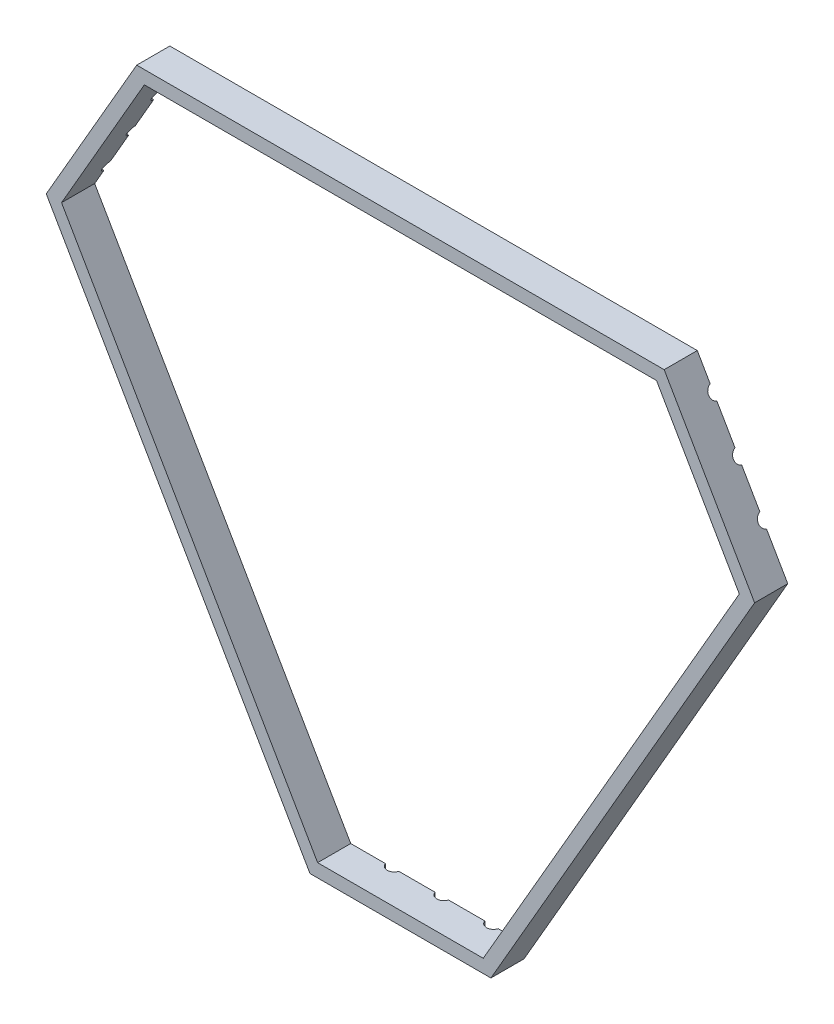
ISO-10303-21;
HEADER;
FILE_DESCRIPTION(('STEP AP214'),'2;1');
FILE_NAME('part.step','',(''),(''),'','','');
FILE_SCHEMA(('AUTOMOTIVE_DESIGN { 1 0 10303 214 1 1 1 1 }'));
ENDSEC;
DATA;
#1=APPLICATION_CONTEXT('core data for automotive mechanical design processes');
#2=APPLICATION_PROTOCOL_DEFINITION('international standard','automotive_design',2000,#1);
#3=PRODUCT_CONTEXT('',#1,'mechanical');
#4=PRODUCT('Part','Part','',(#3));
#5=PRODUCT_RELATED_PRODUCT_CATEGORY('part','',(#4));
#6=PRODUCT_DEFINITION_FORMATION('','',#4);
#7=PRODUCT_DEFINITION_CONTEXT('part definition',#1,'design');
#8=PRODUCT_DEFINITION('design','',#6,#7);
#9=PRODUCT_DEFINITION_SHAPE('','',#8);
#10=(LENGTH_UNIT() NAMED_UNIT(*) SI_UNIT(.MILLI.,.METRE.));
#11=(NAMED_UNIT(*) PLANE_ANGLE_UNIT() SI_UNIT($,.RADIAN.));
#12=(NAMED_UNIT(*) SI_UNIT($,.STERADIAN.) SOLID_ANGLE_UNIT());
#13=UNCERTAINTY_MEASURE_WITH_UNIT(LENGTH_MEASURE(1.E-05),#10,'distance_accuracy_value','');
#14=(GEOMETRIC_REPRESENTATION_CONTEXT(3) GLOBAL_UNCERTAINTY_ASSIGNED_CONTEXT((#13)) GLOBAL_UNIT_ASSIGNED_CONTEXT((#10,
#11,#12)) REPRESENTATION_CONTEXT('',''));
#15=CARTESIAN_POINT('',(0.,0.,0.));
#16=DIRECTION('',(0.,0.,1.));
#17=DIRECTION('',(1.,0.,0.));
#18=AXIS2_PLACEMENT_3D('',#15,#16,#17);
#19=CARTESIAN_POINT('',(0.,0.,-160.));
#20=DIRECTION('',(0.,0.,-1.));
#21=DIRECTION('',(-1.,0.,0.));
#22=AXIS2_PLACEMENT_3D('',#19,#20,#21);
#23=PLANE('',#22);
#24=DIRECTION('',(-0.499999995522719,0.866025406369398,0.));
#25=VECTOR('',#24,1.);
#26=CARTESIAN_POINT('',(-3.99997235182845,-287.07186238818,-160.));
#27=LINE('',#26,#25);
#28=CARTESIAN_POINT('',(-49.9999985666202,-207.397470720706,-160.));
#29=VERTEX_POINT('',#28);
#30=CARTESIAN_POINT('',(-204.611479041461,60.3974639297883,-160.));
#31=VERTEX_POINT('',#30);
#32=EDGE_CURVE('E339',#29,#31,#27,.T.);
#33=ORIENTED_EDGE('',*,*,#32,.T.);
#34=DIRECTION('',(0.500000000000001,0.866025403784438,0.));
#35=VECTOR('',#34,1.);
#36=CARTESIAN_POINT('',(-181.611475801544,100.234638115573,-160.));
#37=LINE('',#36,#35);
#38=CARTESIAN_POINT('',(-154.611479041461,147.000004308232,-160.));
#39=VERTEX_POINT('',#38);
#40=EDGE_CURVE('E323',#31,#39,#37,.T.);
#41=ORIENTED_EDGE('',*,*,#40,.T.);
#42=DIRECTION('',(1.,1.37761646906916E-10,0.));
#43=VECTOR('',#42,1.);
#44=CARTESIAN_POINT('',(-246.611440606458,147.000004295558,-160.));
#45=LINE('',#44,#43);
#46=CARTESIAN_POINT('',(154.611477608082,147.000006790919,-160.));
#47=VERTEX_POINT('',#46);
#48=EDGE_CURVE('E303',#39,#47,#45,.T.);
#49=ORIENTED_EDGE('',*,*,#48,.T.);
#50=DIRECTION('',(0.499999999999999,-0.866025403784439,0.));
#51=VECTOR('',#50,1.);
#52=CARTESIAN_POINT('',(177.611480847998,107.162832605133,-160.));
#53=LINE('',#52,#51);
#54=CARTESIAN_POINT('',(204.611504666339,60.3974195461969,-160.));
#55=VERTEX_POINT('',#54);
#56=EDGE_CURVE('E299',#47,#55,#53,.T.);
#57=ORIENTED_EDGE('',*,*,#56,.T.);
#58=DIRECTION('',(-0.499999988947861,-0.866025410165394,0.));
#59=VECTOR('',#58,1.);
#60=CARTESIAN_POINT('',(250.611606942048,140.071936189287,-160.));
#61=LINE('',#60,#59);
#62=CARTESIAN_POINT('',(50.0000572399014,-207.397470720707,-160.));
#63=VERTEX_POINT('',#62);
#64=EDGE_CURVE('E284',#55,#63,#61,.T.);
#65=ORIENTED_EDGE('',*,*,#64,.T.);
#66=DIRECTION('',(-1.,0.,0.));
#67=VECTOR('',#66,1.);
#68=CARTESIAN_POINT('',(3.99999495354567,-207.397470720707,-160.));
#69=LINE('',#68,#67);
#70=EDGE_CURVE('E473',#63,#29,#69,.T.);
#71=ORIENTED_EDGE('',*,*,#70,.T.);
#72=EDGE_LOOP('',(#33,#41,#49,#57,#65,#71));
#73=FACE_BOUND('',#72,.T.);
#74=DIRECTION('',(0.5,-0.866025403784439,0.));
#75=VECTOR('',#74,1.);
#76=CARTESIAN_POINT('',(-121.761531385957,-99.1028412015677,-160.));
#77=LINE('',#76,#75);
#78=CARTESIAN_POINT('',(-213.849079444843,60.3974706911128,-160.));
#79=VERTEX_POINT('',#78);
#80=CARTESIAN_POINT('',(-54.6187957541475,-215.397470720707,-160.));
#81=VERTEX_POINT('',#80);
#82=EDGE_CURVE('E328',#79,#81,#77,.T.);
#83=ORIENTED_EDGE('',*,*,#82,.T.);
#84=DIRECTION('',(-1.,0.,0.));
#85=VECTOR('',#84,1.);
#86=CARTESIAN_POINT('',(70.0008495564807,-215.397470720707,-160.));
#87=LINE('',#86,#85);
#88=CARTESIAN_POINT('',(54.6187957366916,-215.397470720707,-160.));
#89=VERTEX_POINT('',#88);
#90=EDGE_CURVE('E343',#89,#81,#87,.T.);
#91=ORIENTED_EDGE('',*,*,#90,.F.);
#92=DIRECTION('',(0.499999999940077,0.866025403819035,0.));
#93=VECTOR('',#92,1.);
#94=CARTESIAN_POINT('',(0.,-310.,-160.));
#95=LINE('',#94,#93);
#96=CARTESIAN_POINT('',(213.84907941067,60.3974707503004,-160.));
#97=VERTEX_POINT('',#96);
#98=EDGE_CURVE('E46',#89,#97,#95,.T.);
#99=ORIENTED_EDGE('',*,*,#98,.T.);
#100=DIRECTION('',(0.499999999999999,-0.866025403784439,0.));
#101=VECTOR('',#100,1.);
#102=CARTESIAN_POINT('',(151.539256776807,168.321249362758,-160.));
#103=LINE('',#102,#101);
#104=CARTESIAN_POINT('',(159.230283669615,155.000000022035,-160.));
#105=VERTEX_POINT('',#104);
#106=EDGE_CURVE('E352',#105,#97,#103,.T.);
#107=ORIENTED_EDGE('',*,*,#106,.F.);
#108=DIRECTION('',(-1.,-1.38387047711903E-10,0.));
#109=VECTOR('',#108,1.);
#110=CARTESIAN_POINT('',(268.467875151726,155.000000037152,-160.));
#111=LINE('',#110,#109);
#112=CARTESIAN_POINT('',(-159.230283695059,154.999999977965,-160.));
#113=VERTEX_POINT('',#112);
#114=EDGE_CURVE('E470',#105,#113,#111,.T.);
#115=ORIENTED_EDGE('',*,*,#114,.T.);
#116=DIRECTION('',(0.500000000000001,0.866025403784438,0.));
#117=VECTOR('',#116,1.);
#118=CARTESIAN_POINT('',(-221.540106333287,47.0762213579484,-160.));
#119=LINE('',#118,#117);
#120=EDGE_CURVE('E338',#79,#113,#119,.T.);
#121=ORIENTED_EDGE('',*,*,#120,.F.);
#122=EDGE_LOOP('',(#83,#91,#99,#107,#115,#121));
#123=FACE_BOUND('',#122,.T.);
#124=ADVANCED_FACE('F42',(#73,#123),#23,.F.);
#125=CARTESIAN_POINT('',(0.,0.,-180.));
#126=DIRECTION('',(0.,0.,-1.));
#127=DIRECTION('',(-1.,0.,0.));
#128=AXIS2_PLACEMENT_3D('',#125,#126,#127);
#129=PLANE('',#128);
#130=DIRECTION('',(0.500000000000001,0.866025403784438,0.));
#131=VECTOR('',#130,1.);
#132=CARTESIAN_POINT('',(-181.611475801544,100.234638115573,-180.));
#133=LINE('',#132,#131);
#134=CARTESIAN_POINT('',(-195.080469440302,76.9056568064219,-180.));
#135=VERTEX_POINT('',#134);
#136=CARTESIAN_POINT('',(-184.14248864262,95.8507952802198,-180.));
#137=VERTEX_POINT('',#136);
#138=EDGE_CURVE('E346',#135,#137,#133,.T.);
#139=ORIENTED_EDGE('',*,*,#138,.F.);
#140=DIRECTION('',(-0.866025403784439,0.5,0.));
#141=VECTOR('',#140,1.);
#142=CARTESIAN_POINT('',(-195.080469440302,76.9056568064219,-180.));
#143=LINE('',#142,#141);
#144=CARTESIAN_POINT('',(-202.008672670578,80.9056568064221,-180.));
#145=VERTEX_POINT('',#144);
#146=EDGE_CURVE('E311',#135,#145,#143,.T.);
#147=ORIENTED_EDGE('',*,*,#146,.T.);
#148=DIRECTION('',(0.500000000000001,0.866025403784438,0.));
#149=VECTOR('',#148,1.);
#150=CARTESIAN_POINT('',(-221.540106333287,47.0762213579484,-180.));
#151=LINE('',#150,#149);
#152=CARTESIAN_POINT('',(-191.070691872896,99.85079528022,-180.));
#153=VERTEX_POINT('',#152);
#154=EDGE_CURVE('E508',#145,#153,#151,.T.);
#155=ORIENTED_EDGE('',*,*,#154,.T.);
#156=DIRECTION('',(-0.866025403784438,0.5,0.));
#157=VECTOR('',#156,1.);
#158=CARTESIAN_POINT('',(-184.14248864262,95.8507952802198,-180.));
#159=LINE('',#158,#157);
#160=EDGE_CURVE('E308',#153,#137,#159,.F.);
#161=ORIENTED_EDGE('',*,*,#160,.T.);
#162=EDGE_LOOP('',(#139,#147,#155,#161));
#163=FACE_BOUND('',#162,.T.);
#164=ADVANCED_FACE('F506',(#163),#129,.T.);
#165=CARTESIAN_POINT('',(-187.008672670578,106.886418919955,-180.));
#166=VERTEX_POINT('',#165);
#167=CARTESIAN_POINT('',(-176.070691872896,125.831557393754,-180.));
#168=VERTEX_POINT('',#167);
#169=EDGE_CURVE('E333',#166,#168,#151,.T.);
#170=ORIENTED_EDGE('',*,*,#169,.T.);
#171=DIRECTION('',(-0.866025403784439,0.5,0.));
#172=VECTOR('',#171,1.);
#173=CARTESIAN_POINT('',(-169.14248864262,121.831557393753,-180.));
#174=LINE('',#173,#172);
#175=CARTESIAN_POINT('',(-169.14248864262,121.831557393753,-180.));
#176=VERTEX_POINT('',#175);
#177=EDGE_CURVE('E320',#168,#176,#174,.F.);
#178=ORIENTED_EDGE('',*,*,#177,.T.);
#179=CARTESIAN_POINT('',(-180.080469440302,102.886418919955,-180.));
#180=VERTEX_POINT('',#179);
#181=EDGE_CURVE('E494',#180,#176,#133,.T.);
#182=ORIENTED_EDGE('',*,*,#181,.F.);
#183=DIRECTION('',(-0.866025403784438,0.5,0.));
#184=VECTOR('',#183,1.);
#185=CARTESIAN_POINT('',(-180.080469440302,102.886418919955,-180.));
#186=LINE('',#185,#184);
#187=EDGE_CURVE('E305',#180,#166,#186,.T.);
#188=ORIENTED_EDGE('',*,*,#187,.T.);
#189=EDGE_LOOP('',(#170,#178,#182,#188));
#190=FACE_BOUND('',#189,.T.);
#191=ADVANCED_FACE('F513',(#190),#129,.T.);
#192=DIRECTION('',(-0.866025403784439,0.5,0.));
#193=VECTOR('',#192,1.);
#194=CARTESIAN_POINT('',(-165.080469440302,128.867181033489,-180.));
#195=LINE('',#194,#193);
#196=CARTESIAN_POINT('',(-165.080469440302,128.867181033489,-180.));
#197=VERTEX_POINT('',#196);
#198=CARTESIAN_POINT('',(-172.008672670578,132.867181033489,-180.));
#199=VERTEX_POINT('',#198);
#200=EDGE_CURVE('E317',#197,#199,#195,.T.);
#201=ORIENTED_EDGE('',*,*,#200,.T.);
#202=CARTESIAN_POINT('',(-159.230283695059,154.999999977965,-180.));
#203=VERTEX_POINT('',#202);
#204=EDGE_CURVE('E330',#199,#203,#151,.T.);
#205=ORIENTED_EDGE('',*,*,#204,.T.);
#206=DIRECTION('',(-1.,-1.38387047711903E-10,0.));
#207=VECTOR('',#206,1.);
#208=CARTESIAN_POINT('',(268.467875151726,155.000000037152,-180.));
#209=LINE('',#208,#207);
#210=CARTESIAN_POINT('',(159.230283669615,155.000000022035,-180.));
#211=VERTEX_POINT('',#210);
#212=EDGE_CURVE('E351',#211,#203,#209,.T.);
#213=ORIENTED_EDGE('',*,*,#212,.F.);
#214=DIRECTION('',(0.499999999999999,-0.866025403784439,0.));
#215=VECTOR('',#214,1.);
#216=CARTESIAN_POINT('',(151.539256776807,168.321249362758,-180.));
#217=LINE('',#216,#215);
#218=CARTESIAN_POINT('',(167.008671237198,141.52743755402,-180.));
#219=VERTEX_POINT('',#218);
#220=EDGE_CURVE('E304',#211,#219,#217,.T.);
#221=ORIENTED_EDGE('',*,*,#220,.T.);
#222=DIRECTION('',(0.866025403784439,0.5,0.));
#223=VECTOR('',#222,1.);
#224=CARTESIAN_POINT('',(160.080468006922,137.52743755402,-180.));
#225=LINE('',#224,#223);
#226=CARTESIAN_POINT('',(160.080468006922,137.52743755402,-180.));
#227=VERTEX_POINT('',#226);
#228=EDGE_CURVE('E290',#219,#227,#225,.F.);
#229=ORIENTED_EDGE('',*,*,#228,.T.);
#230=DIRECTION('',(0.499999999999999,-0.866025403784439,0.));
#231=VECTOR('',#230,1.);
#232=CARTESIAN_POINT('',(177.611480847998,107.162832605133,-180.));
#233=LINE('',#232,#231);
#234=CARTESIAN_POINT('',(154.611477608082,147.000006790919,-180.));
#235=VERTEX_POINT('',#234);
#236=EDGE_CURVE('E355',#235,#227,#233,.T.);
#237=ORIENTED_EDGE('',*,*,#236,.F.);
#238=DIRECTION('',(1.,1.37761646906916E-10,0.));
#239=VECTOR('',#238,1.);
#240=CARTESIAN_POINT('',(-246.611440606458,147.000004295558,-180.));
#241=LINE('',#240,#239);
#242=CARTESIAN_POINT('',(-154.611479041461,147.000004308232,-180.));
#243=VERTEX_POINT('',#242);
#244=EDGE_CURVE('E348',#243,#235,#241,.T.);
#245=ORIENTED_EDGE('',*,*,#244,.F.);
#246=EDGE_CURVE('E347',#197,#243,#133,.T.);
#247=ORIENTED_EDGE('',*,*,#246,.F.);
#248=EDGE_LOOP('',(#201,#205,#213,#221,#229,#237,#245,#247));
#249=FACE_BOUND('',#248,.T.);
#250=ADVANCED_FACE('F519',(#249),#129,.T.);
#251=CARTESIAN_POINT('',(164.14248720924,130.491813914284,-180.));
#252=VERTEX_POINT('',#251);
#253=CARTESIAN_POINT('',(175.080468006922,111.546675440487,-180.));
#254=VERTEX_POINT('',#253);
#255=EDGE_CURVE('E358',#252,#254,#233,.T.);
#256=ORIENTED_EDGE('',*,*,#255,.F.);
#257=DIRECTION('',(0.866025403784439,0.5,0.));
#258=VECTOR('',#257,1.);
#259=CARTESIAN_POINT('',(164.14248720924,130.491813914284,-180.));
#260=LINE('',#259,#258);
#261=CARTESIAN_POINT('',(171.070690439516,134.491813914285,-180.));
#262=VERTEX_POINT('',#261);
#263=EDGE_CURVE('E287',#252,#262,#260,.T.);
#264=ORIENTED_EDGE('',*,*,#263,.T.);
#265=CARTESIAN_POINT('',(182.008671237198,115.546675440487,-180.));
#266=VERTEX_POINT('',#265);
#267=EDGE_CURVE('E630',#262,#266,#217,.T.);
#268=ORIENTED_EDGE('',*,*,#267,.T.);
#269=DIRECTION('',(0.866025403784439,0.5,0.));
#270=VECTOR('',#269,1.);
#271=CARTESIAN_POINT('',(175.080468006922,111.546675440487,-180.));
#272=LINE('',#271,#270);
#273=EDGE_CURVE('E283',#266,#254,#272,.F.);
#274=ORIENTED_EDGE('',*,*,#273,.T.);
#275=EDGE_LOOP('',(#256,#264,#268,#274));
#276=FACE_BOUND('',#275,.T.);
#277=ADVANCED_FACE('F590',(#276),#129,.T.);
#278=CARTESIAN_POINT('',(186.070690439516,108.511051800752,-180.));
#279=VERTEX_POINT('',#278);
#280=CARTESIAN_POINT('',(197.008671237198,89.5659133269539,-180.));
#281=VERTEX_POINT('',#280);
#282=EDGE_CURVE('E302',#279,#281,#217,.T.);
#283=ORIENTED_EDGE('',*,*,#282,.T.);
#284=DIRECTION('',(0.866025403784439,0.5,0.));
#285=VECTOR('',#284,1.);
#286=CARTESIAN_POINT('',(190.080468006922,85.5659133269537,-180.));
#287=LINE('',#286,#285);
#288=CARTESIAN_POINT('',(190.080468006922,85.5659133269537,-180.));
#289=VERTEX_POINT('',#288);
#290=EDGE_CURVE('E296',#281,#289,#287,.F.);
#291=ORIENTED_EDGE('',*,*,#290,.T.);
#292=CARTESIAN_POINT('',(179.14248720924,104.511051800751,-180.));
#293=VERTEX_POINT('',#292);
#294=EDGE_CURVE('E636',#293,#289,#233,.T.);
#295=ORIENTED_EDGE('',*,*,#294,.F.);
#296=DIRECTION('',(0.866025403784439,0.5,0.));
#297=VECTOR('',#296,1.);
#298=CARTESIAN_POINT('',(179.14248720924,104.511051800751,-180.));
#299=LINE('',#298,#297);
#300=EDGE_CURVE('E280',#293,#279,#299,.T.);
#301=ORIENTED_EDGE('',*,*,#300,.T.);
#302=EDGE_LOOP('',(#283,#291,#295,#301));
#303=FACE_BOUND('',#302,.T.);
#304=ADVANCED_FACE('F583',(#303),#129,.T.);
#305=CARTESIAN_POINT('',(-213.849079444843,60.3974706911128,-180.));
#306=VERTEX_POINT('',#305);
#307=CARTESIAN_POINT('',(-206.070691872896,73.8700331666869,-180.));
#308=VERTEX_POINT('',#307);
#309=EDGE_CURVE('E334',#306,#308,#151,.T.);
#310=ORIENTED_EDGE('',*,*,#309,.T.);
#311=DIRECTION('',(-0.866025403784439,0.5,0.));
#312=VECTOR('',#311,1.);
#313=CARTESIAN_POINT('',(-199.14248864262,69.8700331666867,-180.));
#314=LINE('',#313,#312);
#315=CARTESIAN_POINT('',(-199.14248864262,69.8700331666867,-180.));
#316=VERTEX_POINT('',#315);
#317=EDGE_CURVE('E314',#308,#316,#314,.F.);
#318=ORIENTED_EDGE('',*,*,#317,.T.);
#319=CARTESIAN_POINT('',(-204.611479041461,60.3974639297883,-180.));
#320=VERTEX_POINT('',#319);
#321=EDGE_CURVE('E342',#320,#316,#133,.T.);
#322=ORIENTED_EDGE('',*,*,#321,.F.);
#323=DIRECTION('',(-0.499999995522719,0.866025406369398,0.));
#324=VECTOR('',#323,1.);
#325=CARTESIAN_POINT('',(-3.99997235182845,-287.07186238818,-180.));
#326=LINE('',#325,#324);
#327=CARTESIAN_POINT('',(-49.9999985666202,-207.397470720706,-180.));
#328=VERTEX_POINT('',#327);
#329=EDGE_CURVE('E335',#328,#320,#326,.T.);
#330=ORIENTED_EDGE('',*,*,#329,.F.);
#331=DIRECTION('',(-1.,0.,0.));
#332=VECTOR('',#331,1.);
#333=CARTESIAN_POINT('',(3.99999495354567,-207.397470720707,-180.));
#334=LINE('',#333,#332);
#335=CARTESIAN_POINT('',(-29.0620177689376,-207.397470720707,-180.));
#336=VERTEX_POINT('',#335);
#337=EDGE_CURVE('E354',#336,#328,#334,.T.);
#338=ORIENTED_EDGE('',*,*,#337,.F.);
#339=DIRECTION('',(0.,-1.,0.));
#340=VECTOR('',#339,1.);
#341=CARTESIAN_POINT('',(-29.0620177689376,-207.397470720707,-180.));
#342=LINE('',#341,#340);
#343=CARTESIAN_POINT('',(-29.0620177689376,-215.397470720707,-180.));
#344=VERTEX_POINT('',#343);
#345=EDGE_CURVE('E274',#336,#344,#342,.T.);
#346=ORIENTED_EDGE('',*,*,#345,.T.);
#347=DIRECTION('',(-1.,0.,0.));
#348=VECTOR('',#347,1.);
#349=CARTESIAN_POINT('',(70.0008495564807,-215.397470720707,-180.));
#350=LINE('',#349,#348);
#351=CARTESIAN_POINT('',(-54.6187957541475,-215.397470720707,-180.));
#352=VERTEX_POINT('',#351);
#353=EDGE_CURVE('E324',#344,#352,#350,.T.);
#354=ORIENTED_EDGE('',*,*,#353,.T.);
#355=DIRECTION('',(0.5,-0.866025403784439,0.));
#356=VECTOR('',#355,1.);
#357=CARTESIAN_POINT('',(-121.761531385957,-99.1028412015677,-180.));
#358=LINE('',#357,#356);
#359=EDGE_CURVE('E340',#306,#352,#358,.T.);
#360=ORIENTED_EDGE('',*,*,#359,.F.);
#361=EDGE_LOOP('',(#310,#318,#322,#330,#338,#346,#354,#360));
#362=FACE_BOUND('',#361,.T.);
#363=ADVANCED_FACE('F548',(#362),#129,.T.);
#364=CARTESIAN_POINT('',(194.14248720924,78.5302896872185,-180.));
#365=VERTEX_POINT('',#364);
#366=CARTESIAN_POINT('',(204.611504666339,60.3974195461969,-180.));
#367=VERTEX_POINT('',#366);
#368=EDGE_CURVE('E359',#365,#367,#233,.T.);
#369=ORIENTED_EDGE('',*,*,#368,.F.);
#370=DIRECTION('',(0.866025403784439,0.5,0.));
#371=VECTOR('',#370,1.);
#372=CARTESIAN_POINT('',(194.14248720924,78.5302896872185,-180.));
#373=LINE('',#372,#371);
#374=CARTESIAN_POINT('',(201.070690439516,82.5302896872188,-180.));
#375=VERTEX_POINT('',#374);
#376=EDGE_CURVE('E293',#365,#375,#373,.T.);
#377=ORIENTED_EDGE('',*,*,#376,.T.);
#378=CARTESIAN_POINT('',(213.84907941067,60.3974707503004,-180.));
#379=VERTEX_POINT('',#378);
#380=EDGE_CURVE('E300',#375,#379,#217,.T.);
#381=ORIENTED_EDGE('',*,*,#380,.T.);
#382=DIRECTION('',(0.499999999940077,0.866025403819035,0.));
#383=VECTOR('',#382,1.);
#384=CARTESIAN_POINT('',(0.,-310.,-180.));
#385=LINE('',#384,#383);
#386=CARTESIAN_POINT('',(54.6187957366916,-215.397470720707,-180.));
#387=VERTEX_POINT('',#386);
#388=EDGE_CURVE('E60',#387,#379,#385,.T.);
#389=ORIENTED_EDGE('',*,*,#388,.F.);
#390=CARTESIAN_POINT('',(39.0620206356984,-215.397470720707,-180.));
#391=VERTEX_POINT('',#390);
#392=EDGE_CURVE('E329',#387,#391,#350,.T.);
#393=ORIENTED_EDGE('',*,*,#392,.T.);
#394=DIRECTION('',(0.,-1.,0.));
#395=VECTOR('',#394,1.);
#396=CARTESIAN_POINT('',(39.0620206356984,-207.397470720707,-180.));
#397=LINE('',#396,#395);
#398=CARTESIAN_POINT('',(39.0620206356984,-207.397470720707,-180.));
#399=VERTEX_POINT('',#398);
#400=EDGE_CURVE('E267',#391,#399,#397,.F.);
#401=ORIENTED_EDGE('',*,*,#400,.T.);
#402=CARTESIAN_POINT('',(50.0000572399014,-207.397470720707,-180.));
#403=VERTEX_POINT('',#402);
#404=EDGE_CURVE('E259',#403,#399,#334,.T.);
#405=ORIENTED_EDGE('',*,*,#404,.F.);
#406=DIRECTION('',(-0.499999988947861,-0.866025410165394,0.));
#407=VECTOR('',#406,1.);
#408=CARTESIAN_POINT('',(250.611606942048,140.071936189287,-180.));
#409=LINE('',#408,#407);
#410=EDGE_CURVE('E360',#367,#403,#409,.T.);
#411=ORIENTED_EDGE('',*,*,#410,.F.);
#412=EDGE_LOOP('',(#369,#377,#381,#389,#393,#401,#405,#411));
#413=FACE_BOUND('',#412,.T.);
#414=ADVANCED_FACE('F569',(#413),#129,.T.);
#415=CARTESIAN_POINT('',(30.9379822310624,-207.397470720707,-180.));
#416=VERTEX_POINT('',#415);
#417=CARTESIAN_POINT('',(9.06202063569835,-207.397470720707,-180.));
#418=VERTEX_POINT('',#417);
#419=EDGE_CURVE('E251',#416,#418,#334,.T.);
#420=ORIENTED_EDGE('',*,*,#419,.F.);
#421=DIRECTION('',(0.,-1.,0.));
#422=VECTOR('',#421,1.);
#423=CARTESIAN_POINT('',(30.9379822310624,-207.397470720707,-180.));
#424=LINE('',#423,#422);
#425=CARTESIAN_POINT('',(30.9379822310624,-215.397470720707,-180.));
#426=VERTEX_POINT('',#425);
#427=EDGE_CURVE('E265',#416,#426,#424,.T.);
#428=ORIENTED_EDGE('',*,*,#427,.T.);
#429=CARTESIAN_POINT('',(9.06202063569835,-215.397470720707,-180.));
#430=VERTEX_POINT('',#429);
#431=EDGE_CURVE('E264',#426,#430,#350,.T.);
#432=ORIENTED_EDGE('',*,*,#431,.T.);
#433=DIRECTION('',(0.,-1.,0.));
#434=VECTOR('',#433,1.);
#435=CARTESIAN_POINT('',(9.06202063569835,-207.397470720707,-180.));
#436=LINE('',#435,#434);
#437=EDGE_CURVE('E244',#430,#418,#436,.F.);
#438=ORIENTED_EDGE('',*,*,#437,.T.);
#439=EDGE_LOOP('',(#420,#428,#432,#438));
#440=FACE_BOUND('',#439,.T.);
#441=ADVANCED_FACE('F262',(#440),#129,.T.);
#442=CARTESIAN_POINT('',(0.937982231062389,-215.397470720707,-180.));
#443=VERTEX_POINT('',#442);
#444=CARTESIAN_POINT('',(-20.9379793643016,-215.397470720707,-180.));
#445=VERTEX_POINT('',#444);
#446=EDGE_CURVE('E327',#443,#445,#350,.T.);
#447=ORIENTED_EDGE('',*,*,#446,.T.);
#448=DIRECTION('',(0.,-1.,0.));
#449=VECTOR('',#448,1.);
#450=CARTESIAN_POINT('',(-20.9379793643016,-207.397470720707,-180.));
#451=LINE('',#450,#449);
#452=CARTESIAN_POINT('',(-20.9379793643016,-207.397470720707,-180.));
#453=VERTEX_POINT('',#452);
#454=EDGE_CURVE('E277',#445,#453,#451,.F.);
#455=ORIENTED_EDGE('',*,*,#454,.T.);
#456=CARTESIAN_POINT('',(0.937982231062389,-207.397470720707,-180.));
#457=VERTEX_POINT('',#456);
#458=EDGE_CURVE('E258',#457,#453,#334,.T.);
#459=ORIENTED_EDGE('',*,*,#458,.F.);
#460=DIRECTION('',(0.,-1.,0.));
#461=VECTOR('',#460,1.);
#462=CARTESIAN_POINT('',(0.937982231062389,-207.397470720707,-180.));
#463=LINE('',#462,#461);
#464=EDGE_CURVE('E246',#457,#443,#463,.T.);
#465=ORIENTED_EDGE('',*,*,#464,.T.);
#466=EDGE_LOOP('',(#447,#455,#459,#465));
#467=FACE_BOUND('',#466,.T.);
#468=ADVANCED_FACE('F556',(#467),#129,.T.);
#469=CARTESIAN_POINT('',(-181.611475801544,100.234638115573,140.));
#470=DIRECTION('',(0.866025403784437,-0.5,0.));
#471=DIRECTION('',(0.,0.,-1.));
#472=AXIS2_PLACEMENT_3D('',#469,#470,#471);
#473=PLANE('',#472);
#474=ORIENTED_EDGE('',*,*,#40,.F.);
#475=DIRECTION('',(0.,0.,-1.));
#476=VECTOR('',#475,1.);
#477=CARTESIAN_POINT('',(-204.611479041461,60.3974639297883,140.));
#478=LINE('',#477,#476);
#479=EDGE_CURVE('E445',#31,#320,#478,.T.);
#480=ORIENTED_EDGE('',*,*,#479,.T.);
#481=ORIENTED_EDGE('',*,*,#321,.T.);
#482=CARTESIAN_POINT('',(-197.111479041461,73.3878449865543,-181.25));
#483=DIRECTION('',(-0.866025403784439,0.5,0.));
#484=DIRECTION('',(0.5,0.866025403784439,0.));
#485=AXIS2_PLACEMENT_3D('',#482,#483,#484);
#486=CIRCLE('',#485,4.25);
#487=EDGE_CURVE('E427',#316,#135,#486,.T.);
#488=ORIENTED_EDGE('',*,*,#487,.T.);
#489=ORIENTED_EDGE('',*,*,#138,.T.);
#490=CARTESIAN_POINT('',(-182.111479041461,99.3686071000874,-181.25));
#491=DIRECTION('',(-0.866025403784438,0.5,0.));
#492=DIRECTION('',(0.5,0.866025403784438,0.));
#493=AXIS2_PLACEMENT_3D('',#490,#491,#492);
#494=CIRCLE('',#493,4.25);
#495=EDGE_CURVE('E420',#137,#180,#494,.T.);
#496=ORIENTED_EDGE('',*,*,#495,.T.);
#497=ORIENTED_EDGE('',*,*,#181,.T.);
#498=CARTESIAN_POINT('',(-167.111479041461,125.349369213621,-181.25));
#499=DIRECTION('',(-0.866025403784439,0.5,0.));
#500=DIRECTION('',(0.5,0.866025403784439,0.));
#501=AXIS2_PLACEMENT_3D('',#498,#499,#500);
#502=CIRCLE('',#501,4.25);
#503=EDGE_CURVE('E433',#176,#197,#502,.T.);
#504=ORIENTED_EDGE('',*,*,#503,.T.);
#505=ORIENTED_EDGE('',*,*,#246,.T.);
#506=DIRECTION('',(0.,0.,-1.));
#507=VECTOR('',#506,1.);
#508=CARTESIAN_POINT('',(-154.611479041461,147.000004308232,140.));
#509=LINE('',#508,#507);
#510=EDGE_CURVE('E437',#39,#243,#509,.T.);
#511=ORIENTED_EDGE('',*,*,#510,.F.);
#512=EDGE_LOOP('',(#474,#480,#481,#488,#489,#496,#497,#504,#505,#511));
#513=FACE_BOUND('',#512,.T.);
#514=ADVANCED_FACE('F501',(#513),#473,.T.);
#515=CARTESIAN_POINT('',(-221.540106333287,47.0762213579484,0.));
#516=DIRECTION('',(0.866025403784437,-0.5,0.));
#517=DIRECTION('',(0.,0.,-1.));
#518=AXIS2_PLACEMENT_3D('',#515,#516,#517);
#519=PLANE('',#518);
#520=DIRECTION('',(0.,0.,-1.));
#521=VECTOR('',#520,1.);
#522=CARTESIAN_POINT('',(-213.849079444843,60.3974706911128,0.));
#523=LINE('',#522,#521);
#524=EDGE_CURVE('E363',#79,#306,#523,.T.);
#525=ORIENTED_EDGE('',*,*,#524,.F.);
#526=ORIENTED_EDGE('',*,*,#120,.T.);
#527=DIRECTION('',(0.,0.,1.));
#528=VECTOR('',#527,1.);
#529=CARTESIAN_POINT('',(-159.230283695059,154.999999977965,0.));
#530=LINE('',#529,#528);
#531=EDGE_CURVE('E423',#203,#113,#530,.T.);
#532=ORIENTED_EDGE('',*,*,#531,.F.);
#533=ORIENTED_EDGE('',*,*,#204,.F.);
#534=CARTESIAN_POINT('',(-174.039682271737,129.349369213621,-181.25));
#535=DIRECTION('',(0.866025403784439,-0.5,0.));
#536=DIRECTION('',(0.5,0.866025403784439,0.));
#537=AXIS2_PLACEMENT_3D('',#534,#535,#536);
#538=CIRCLE('',#537,4.25);
#539=EDGE_CURVE('E435',#199,#168,#538,.T.);
#540=ORIENTED_EDGE('',*,*,#539,.T.);
#541=ORIENTED_EDGE('',*,*,#169,.F.);
#542=CARTESIAN_POINT('',(-189.039682271737,103.368607100087,-181.25));
#543=DIRECTION('',(0.866025403784438,-0.5,0.));
#544=DIRECTION('',(0.5,0.866025403784438,0.));
#545=AXIS2_PLACEMENT_3D('',#542,#543,#544);
#546=CIRCLE('',#545,4.25);
#547=EDGE_CURVE('E424',#166,#153,#546,.T.);
#548=ORIENTED_EDGE('',*,*,#547,.T.);
#549=ORIENTED_EDGE('',*,*,#154,.F.);
#550=CARTESIAN_POINT('',(-204.039682271737,77.3878449865543,-181.25));
#551=DIRECTION('',(0.866025403784439,-0.5,0.));
#552=DIRECTION('',(0.5,0.866025403784439,0.));
#553=AXIS2_PLACEMENT_3D('',#550,#551,#552);
#554=CIRCLE('',#553,4.25);
#555=EDGE_CURVE('E430',#145,#308,#554,.T.);
#556=ORIENTED_EDGE('',*,*,#555,.T.);
#557=ORIENTED_EDGE('',*,*,#309,.F.);
#558=EDGE_LOOP('',(#525,#526,#532,#533,#540,#541,#548,#549,#556,#557));
#559=FACE_BOUND('',#558,.T.);
#560=ADVANCED_FACE('F537',(#559),#519,.F.);
#561=CARTESIAN_POINT('',(-3.99997235182845,-287.07186238818,0.));
#562=DIRECTION('',(0.866025406369398,0.499999995522719,0.));
#563=DIRECTION('',(0.,0.,-1.));
#564=AXIS2_PLACEMENT_3D('',#561,#562,#563);
#565=PLANE('',#564);
#566=ORIENTED_EDGE('',*,*,#32,.F.);
#567=DIRECTION('',(0.,0.,-1.));
#568=VECTOR('',#567,1.);
#569=CARTESIAN_POINT('',(-49.9999985666202,-207.397470720706,140.));
#570=LINE('',#569,#568);
#571=EDGE_CURVE('E364',#29,#328,#570,.T.);
#572=ORIENTED_EDGE('',*,*,#571,.T.);
#573=ORIENTED_EDGE('',*,*,#329,.T.);
#574=ORIENTED_EDGE('',*,*,#479,.F.);
#575=EDGE_LOOP('',(#566,#572,#573,#574));
#576=FACE_BOUND('',#575,.T.);
#577=ADVANCED_FACE('F563',(#576),#565,.T.);
#578=CARTESIAN_POINT('',(-246.611440606458,147.000004295558,-100.));
#579=DIRECTION('',(1.37761646906916E-10,-1.,0.));
#580=DIRECTION('',(0.,0.,-1.));
#581=AXIS2_PLACEMENT_3D('',#578,#579,#580);
#582=PLANE('',#581);
#583=ORIENTED_EDGE('',*,*,#48,.F.);
#584=ORIENTED_EDGE('',*,*,#510,.T.);
#585=ORIENTED_EDGE('',*,*,#244,.T.);
#586=DIRECTION('',(0.,0.,-1.));
#587=VECTOR('',#586,1.);
#588=CARTESIAN_POINT('',(154.611477608082,147.000006790919,140.));
#589=LINE('',#588,#587);
#590=EDGE_CURVE('E382',#47,#235,#589,.T.);
#591=ORIENTED_EDGE('',*,*,#590,.F.);
#592=EDGE_LOOP('',(#583,#584,#585,#591));
#593=FACE_BOUND('',#592,.T.);
#594=ADVANCED_FACE('F522',(#593),#582,.T.);
#595=CARTESIAN_POINT('',(151.539256776807,168.321249362758,0.));
#596=DIRECTION('',(-0.86602540378444,-0.5,0.));
#597=DIRECTION('',(-0.5,0.86602540378444,0.));
#598=AXIS2_PLACEMENT_3D('',#595,#596,#597);
#599=PLANE('',#598);
#600=DIRECTION('',(0.,0.,-1.));
#601=VECTOR('',#600,1.);
#602=CARTESIAN_POINT('',(159.230283669615,155.000000022035,0.));
#603=LINE('',#602,#601);
#604=EDGE_CURVE('E492',#105,#211,#603,.T.);
#605=ORIENTED_EDGE('',*,*,#604,.F.);
#606=ORIENTED_EDGE('',*,*,#106,.T.);
#607=DIRECTION('',(0.,0.,1.));
#608=VECTOR('',#607,1.);
#609=CARTESIAN_POINT('',(213.84907941067,60.3974707503004,0.));
#610=LINE('',#609,#608);
#611=EDGE_CURVE('E373',#379,#97,#610,.T.);
#612=ORIENTED_EDGE('',*,*,#611,.F.);
#613=ORIENTED_EDGE('',*,*,#380,.F.);
#614=CARTESIAN_POINT('',(199.039680838357,86.0481015070862,-181.25));
#615=DIRECTION('',(-0.866025403784439,-0.5,0.));
#616=DIRECTION('',(0.5,-0.866025403784439,0.));
#617=AXIS2_PLACEMENT_3D('',#614,#615,#616);
#618=CIRCLE('',#617,4.25);
#619=EDGE_CURVE('E389',#375,#281,#618,.T.);
#620=ORIENTED_EDGE('',*,*,#619,.T.);
#621=ORIENTED_EDGE('',*,*,#282,.F.);
#622=CARTESIAN_POINT('',(184.039680838357,112.028863620619,-181.25));
#623=DIRECTION('',(-0.866025403784439,-0.5,0.));
#624=DIRECTION('',(0.5,-0.866025403784439,0.));
#625=AXIS2_PLACEMENT_3D('',#622,#623,#624);
#626=CIRCLE('',#625,4.25);
#627=EDGE_CURVE('E406',#279,#266,#626,.T.);
#628=ORIENTED_EDGE('',*,*,#627,.T.);
#629=ORIENTED_EDGE('',*,*,#267,.F.);
#630=CARTESIAN_POINT('',(169.039680838357,138.009625734153,-181.25));
#631=DIRECTION('',(-0.866025403784439,-0.5,0.));
#632=DIRECTION('',(0.5,-0.866025403784439,0.));
#633=AXIS2_PLACEMENT_3D('',#630,#631,#632);
#634=CIRCLE('',#633,4.25);
#635=EDGE_CURVE('E412',#262,#219,#634,.T.);
#636=ORIENTED_EDGE('',*,*,#635,.T.);
#637=ORIENTED_EDGE('',*,*,#220,.F.);
#638=EDGE_LOOP('',(#605,#606,#612,#613,#620,#621,#628,#629,#636,#637));
#639=FACE_BOUND('',#638,.T.);
#640=ADVANCED_FACE('F489',(#639),#599,.F.);
#641=CARTESIAN_POINT('',(3.99999495354567,-207.397470720707,140.));
#642=DIRECTION('',(0.,1.,0.));
#643=DIRECTION('',(1.,0.,0.));
#644=AXIS2_PLACEMENT_3D('',#641,#642,#643);
#645=PLANE('',#644);
#646=ORIENTED_EDGE('',*,*,#70,.F.);
#647=DIRECTION('',(0.,0.,-1.));
#648=VECTOR('',#647,1.);
#649=CARTESIAN_POINT('',(50.0000572399014,-207.397470720707,0.));
#650=LINE('',#649,#648);
#651=EDGE_CURVE('E369',#63,#403,#650,.T.);
#652=ORIENTED_EDGE('',*,*,#651,.T.);
#653=ORIENTED_EDGE('',*,*,#404,.T.);
#654=CARTESIAN_POINT('',(35.0000014333804,-207.397470720707,-181.25));
#655=DIRECTION('',(0.,-1.,0.));
#656=DIRECTION('',(-1.,0.,0.));
#657=AXIS2_PLACEMENT_3D('',#654,#655,#656);
#658=CIRCLE('',#657,4.25);
#659=EDGE_CURVE('E254',#399,#416,#658,.T.);
#660=ORIENTED_EDGE('',*,*,#659,.T.);
#661=ORIENTED_EDGE('',*,*,#419,.T.);
#662=CARTESIAN_POINT('',(5.00000143338037,-207.397470720707,-181.25));
#663=DIRECTION('',(0.,-1.,0.));
#664=DIRECTION('',(-1.,0.,0.));
#665=AXIS2_PLACEMENT_3D('',#662,#663,#664);
#666=CIRCLE('',#665,4.25);
#667=EDGE_CURVE('E11',#418,#457,#666,.T.);
#668=ORIENTED_EDGE('',*,*,#667,.T.);
#669=ORIENTED_EDGE('',*,*,#458,.T.);
#670=CARTESIAN_POINT('',(-24.9999985666196,-207.397470720707,-181.25));
#671=DIRECTION('',(0.,-1.,0.));
#672=DIRECTION('',(-1.,0.,0.));
#673=AXIS2_PLACEMENT_3D('',#670,#671,#672);
#674=CIRCLE('',#673,4.25);
#675=EDGE_CURVE('E399',#453,#336,#674,.T.);
#676=ORIENTED_EDGE('',*,*,#675,.T.);
#677=ORIENTED_EDGE('',*,*,#337,.T.);
#678=ORIENTED_EDGE('',*,*,#571,.F.);
#679=EDGE_LOOP('',(#646,#652,#653,#660,#661,#668,#669,#676,#677,#678));
#680=FACE_BOUND('',#679,.T.);
#681=ADVANCED_FACE('F252',(#680),#645,.T.);
#682=CARTESIAN_POINT('',(70.0008495564807,-215.397470720707,0.));
#683=DIRECTION('',(0.,1.,0.));
#684=DIRECTION('',(1.,0.,0.));
#685=AXIS2_PLACEMENT_3D('',#682,#683,#684);
#686=PLANE('',#685);
#687=DIRECTION('',(0.,0.,-1.));
#688=VECTOR('',#687,1.);
#689=CARTESIAN_POINT('',(54.6187957366916,-215.397470720707,0.));
#690=LINE('',#689,#688);
#691=EDGE_CURVE('E376',#89,#387,#690,.T.);
#692=ORIENTED_EDGE('',*,*,#691,.F.);
#693=ORIENTED_EDGE('',*,*,#90,.T.);
#694=DIRECTION('',(0.,0.,1.));
#695=VECTOR('',#694,1.);
#696=CARTESIAN_POINT('',(-54.6187957541475,-215.397470720707,0.));
#697=LINE('',#696,#695);
#698=EDGE_CURVE('E452',#352,#81,#697,.T.);
#699=ORIENTED_EDGE('',*,*,#698,.F.);
#700=ORIENTED_EDGE('',*,*,#353,.F.);
#701=CARTESIAN_POINT('',(-24.9999985666196,-215.397470720707,-181.25));
#702=DIRECTION('',(0.,1.,0.));
#703=DIRECTION('',(-1.,0.,0.));
#704=AXIS2_PLACEMENT_3D('',#701,#702,#703);
#705=CIRCLE('',#704,4.25);
#706=EDGE_CURVE('E368',#344,#445,#705,.T.);
#707=ORIENTED_EDGE('',*,*,#706,.T.);
#708=ORIENTED_EDGE('',*,*,#446,.F.);
#709=CARTESIAN_POINT('',(5.00000143338037,-215.397470720707,-181.25));
#710=DIRECTION('',(0.,1.,0.));
#711=DIRECTION('',(-1.,0.,0.));
#712=AXIS2_PLACEMENT_3D('',#709,#710,#711);
#713=CIRCLE('',#712,4.25);
#714=EDGE_CURVE('E52',#443,#430,#713,.T.);
#715=ORIENTED_EDGE('',*,*,#714,.T.);
#716=ORIENTED_EDGE('',*,*,#431,.F.);
#717=CARTESIAN_POINT('',(35.0000014333804,-215.397470720707,-181.25));
#718=DIRECTION('',(0.,1.,0.));
#719=DIRECTION('',(-1.,0.,0.));
#720=AXIS2_PLACEMENT_3D('',#717,#718,#719);
#721=CIRCLE('',#720,4.25);
#722=EDGE_CURVE('E396',#426,#391,#721,.T.);
#723=ORIENTED_EDGE('',*,*,#722,.T.);
#724=ORIENTED_EDGE('',*,*,#392,.F.);
#725=EDGE_LOOP('',(#692,#693,#699,#700,#707,#708,#715,#716,#723,#724));
#726=FACE_BOUND('',#725,.T.);
#727=ADVANCED_FACE('F543',(#726),#686,.F.);
#728=CARTESIAN_POINT('',(5.00000143338037,-207.397470720707,-181.25));
#729=DIRECTION('',(0.,-1.,0.));
#730=DIRECTION('',(-1.,0.,0.));
#731=AXIS2_PLACEMENT_3D('',#728,#729,#730);
#732=CYLINDRICAL_SURFACE('',#731,4.25);
#733=ORIENTED_EDGE('',*,*,#437,.F.);
#734=ORIENTED_EDGE('',*,*,#714,.F.);
#735=ORIENTED_EDGE('',*,*,#464,.F.);
#736=ORIENTED_EDGE('',*,*,#667,.F.);
#737=EDGE_LOOP('',(#733,#734,#735,#736));
#738=FACE_BOUND('',#737,.T.);
#739=ADVANCED_FACE('F242',(#738),#732,.F.);
#740=CARTESIAN_POINT('',(35.0000014333804,-207.397470720707,-181.25));
#741=DIRECTION('',(0.,-1.,0.));
#742=DIRECTION('',(-1.,0.,0.));
#743=AXIS2_PLACEMENT_3D('',#740,#741,#742);
#744=CYLINDRICAL_SURFACE('',#743,4.25);
#745=ORIENTED_EDGE('',*,*,#400,.F.);
#746=ORIENTED_EDGE('',*,*,#722,.F.);
#747=ORIENTED_EDGE('',*,*,#427,.F.);
#748=ORIENTED_EDGE('',*,*,#659,.F.);
#749=EDGE_LOOP('',(#745,#746,#747,#748));
#750=FACE_BOUND('',#749,.T.);
#751=ADVANCED_FACE('F572',(#750),#744,.F.);
#752=CARTESIAN_POINT('',(-24.9999985666196,-207.397470720707,-181.25));
#753=DIRECTION('',(0.,-1.,0.));
#754=DIRECTION('',(-1.,0.,0.));
#755=AXIS2_PLACEMENT_3D('',#752,#753,#754);
#756=CYLINDRICAL_SURFACE('',#755,4.25);
#757=ORIENTED_EDGE('',*,*,#454,.F.);
#758=ORIENTED_EDGE('',*,*,#706,.F.);
#759=ORIENTED_EDGE('',*,*,#345,.F.);
#760=ORIENTED_EDGE('',*,*,#675,.F.);
#761=EDGE_LOOP('',(#757,#758,#759,#760));
#762=FACE_BOUND('',#761,.T.);
#763=ADVANCED_FACE('F557',(#762),#756,.F.);
#764=CARTESIAN_POINT('',(0.,-310.,0.));
#765=DIRECTION('',(0.866025403819035,-0.499999999940077,0.));
#766=DIRECTION('',(0.,0.,-1.));
#767=AXIS2_PLACEMENT_3D('',#764,#765,#766);
#768=PLANE('',#767);
#769=ORIENTED_EDGE('',*,*,#98,.F.);
#770=ORIENTED_EDGE('',*,*,#691,.T.);
#771=ORIENTED_EDGE('',*,*,#388,.T.);
#772=ORIENTED_EDGE('',*,*,#611,.T.);
#773=EDGE_LOOP('',(#769,#770,#771,#772));
#774=FACE_BOUND('',#773,.T.);
#775=ADVANCED_FACE('F486',(#774),#768,.T.);
#776=CARTESIAN_POINT('',(177.611480847998,107.162832605133,140.));
#777=DIRECTION('',(-0.86602540378444,-0.5,0.));
#778=DIRECTION('',(-0.5,0.86602540378444,0.));
#779=AXIS2_PLACEMENT_3D('',#776,#777,#778);
#780=PLANE('',#779);
#781=ORIENTED_EDGE('',*,*,#56,.F.);
#782=ORIENTED_EDGE('',*,*,#590,.T.);
#783=ORIENTED_EDGE('',*,*,#236,.T.);
#784=CARTESIAN_POINT('',(162.111477608081,134.009625734152,-181.25));
#785=DIRECTION('',(0.866025403784439,0.5,0.));
#786=DIRECTION('',(0.5,-0.866025403784439,0.));
#787=AXIS2_PLACEMENT_3D('',#784,#785,#786);
#788=CIRCLE('',#787,4.25);
#789=EDGE_CURVE('E409',#227,#252,#788,.T.);
#790=ORIENTED_EDGE('',*,*,#789,.T.);
#791=ORIENTED_EDGE('',*,*,#255,.T.);
#792=CARTESIAN_POINT('',(177.111477608081,108.028863620619,-181.25));
#793=DIRECTION('',(0.866025403784439,0.5,0.));
#794=DIRECTION('',(0.5,-0.866025403784439,0.));
#795=AXIS2_PLACEMENT_3D('',#792,#793,#794);
#796=CIRCLE('',#795,4.25);
#797=EDGE_CURVE('E379',#254,#293,#796,.T.);
#798=ORIENTED_EDGE('',*,*,#797,.T.);
#799=ORIENTED_EDGE('',*,*,#294,.T.);
#800=CARTESIAN_POINT('',(192.111477608081,82.0481015070861,-181.25));
#801=DIRECTION('',(0.866025403784439,0.5,0.));
#802=DIRECTION('',(0.5,-0.866025403784439,0.));
#803=AXIS2_PLACEMENT_3D('',#800,#801,#802);
#804=CIRCLE('',#803,4.25);
#805=EDGE_CURVE('E415',#289,#365,#804,.T.);
#806=ORIENTED_EDGE('',*,*,#805,.T.);
#807=ORIENTED_EDGE('',*,*,#368,.T.);
#808=DIRECTION('',(0.,0.,-1.));
#809=VECTOR('',#808,1.);
#810=CARTESIAN_POINT('',(204.611504666339,60.3974195461969,140.));
#811=LINE('',#810,#809);
#812=EDGE_CURVE('E385',#55,#367,#811,.T.);
#813=ORIENTED_EDGE('',*,*,#812,.F.);
#814=EDGE_LOOP('',(#781,#782,#783,#790,#791,#798,#799,#806,#807,#813));
#815=FACE_BOUND('',#814,.T.);
#816=ADVANCED_FACE('F524',(#815),#780,.T.);
#817=CARTESIAN_POINT('',(250.611606942048,140.071936189287,0.));
#818=DIRECTION('',(-0.866025410165394,0.499999988947861,0.));
#819=DIRECTION('',(0.,0.,1.));
#820=AXIS2_PLACEMENT_3D('',#817,#818,#819);
#821=PLANE('',#820);
#822=ORIENTED_EDGE('',*,*,#64,.F.);
#823=ORIENTED_EDGE('',*,*,#812,.T.);
#824=ORIENTED_EDGE('',*,*,#410,.T.);
#825=ORIENTED_EDGE('',*,*,#651,.F.);
#826=EDGE_LOOP('',(#822,#823,#824,#825));
#827=FACE_BOUND('',#826,.T.);
#828=ADVANCED_FACE('F566',(#827),#821,.T.);
#829=CARTESIAN_POINT('',(177.111477608081,108.028863620619,-181.25));
#830=DIRECTION('',(0.866025403784439,0.5,0.));
#831=DIRECTION('',(0.5,-0.866025403784439,0.));
#832=AXIS2_PLACEMENT_3D('',#829,#830,#831);
#833=CYLINDRICAL_SURFACE('',#832,4.25);
#834=ORIENTED_EDGE('',*,*,#273,.F.);
#835=ORIENTED_EDGE('',*,*,#627,.F.);
#836=ORIENTED_EDGE('',*,*,#300,.F.);
#837=ORIENTED_EDGE('',*,*,#797,.F.);
#838=EDGE_LOOP('',(#834,#835,#836,#837));
#839=FACE_BOUND('',#838,.T.);
#840=ADVANCED_FACE('F614',(#839),#833,.F.);
#841=CARTESIAN_POINT('',(162.111477608081,134.009625734152,-181.25));
#842=DIRECTION('',(0.866025403784439,0.5,0.));
#843=DIRECTION('',(0.5,-0.866025403784439,0.));
#844=AXIS2_PLACEMENT_3D('',#841,#842,#843);
#845=CYLINDRICAL_SURFACE('',#844,4.25);
#846=ORIENTED_EDGE('',*,*,#228,.F.);
#847=ORIENTED_EDGE('',*,*,#635,.F.);
#848=ORIENTED_EDGE('',*,*,#263,.F.);
#849=ORIENTED_EDGE('',*,*,#789,.F.);
#850=EDGE_LOOP('',(#846,#847,#848,#849));
#851=FACE_BOUND('',#850,.T.);
#852=ADVANCED_FACE('F610',(#851),#845,.F.);
#853=CARTESIAN_POINT('',(192.111477608081,82.0481015070861,-181.25));
#854=DIRECTION('',(0.866025403784439,0.5,0.));
#855=DIRECTION('',(0.5,-0.866025403784439,0.));
#856=AXIS2_PLACEMENT_3D('',#853,#854,#855);
#857=CYLINDRICAL_SURFACE('',#856,4.25);
#858=ORIENTED_EDGE('',*,*,#290,.F.);
#859=ORIENTED_EDGE('',*,*,#619,.F.);
#860=ORIENTED_EDGE('',*,*,#376,.F.);
#861=ORIENTED_EDGE('',*,*,#805,.F.);
#862=EDGE_LOOP('',(#858,#859,#860,#861));
#863=FACE_BOUND('',#862,.T.);
#864=ADVANCED_FACE('F607',(#863),#857,.F.);
#865=CARTESIAN_POINT('',(268.467875151726,155.000000037152,0.));
#866=DIRECTION('',(-1.38387047711903E-10,1.,0.));
#867=DIRECTION('',(0.,0.,1.));
#868=AXIS2_PLACEMENT_3D('',#865,#866,#867);
#869=PLANE('',#868);
#870=ORIENTED_EDGE('',*,*,#114,.F.);
#871=ORIENTED_EDGE('',*,*,#604,.T.);
#872=ORIENTED_EDGE('',*,*,#212,.T.);
#873=ORIENTED_EDGE('',*,*,#531,.T.);
#874=EDGE_LOOP('',(#870,#871,#872,#873));
#875=FACE_BOUND('',#874,.T.);
#876=ADVANCED_FACE('F535',(#875),#869,.T.);
#877=CARTESIAN_POINT('',(-182.111479041461,99.3686071000874,-181.25));
#878=DIRECTION('',(-0.866025403784438,0.5,0.));
#879=DIRECTION('',(0.5,0.866025403784438,0.));
#880=AXIS2_PLACEMENT_3D('',#877,#878,#879);
#881=CYLINDRICAL_SURFACE('',#880,4.25);
#882=ORIENTED_EDGE('',*,*,#160,.F.);
#883=ORIENTED_EDGE('',*,*,#547,.F.);
#884=ORIENTED_EDGE('',*,*,#187,.F.);
#885=ORIENTED_EDGE('',*,*,#495,.F.);
#886=EDGE_LOOP('',(#882,#883,#884,#885));
#887=FACE_BOUND('',#886,.T.);
#888=ADVANCED_FACE('F510',(#887),#881,.F.);
#889=CARTESIAN_POINT('',(-197.111479041461,73.3878449865543,-181.25));
#890=DIRECTION('',(-0.866025403784439,0.5,0.));
#891=DIRECTION('',(0.5,0.866025403784439,0.));
#892=AXIS2_PLACEMENT_3D('',#889,#890,#891);
#893=CYLINDRICAL_SURFACE('',#892,4.25);
#894=ORIENTED_EDGE('',*,*,#317,.F.);
#895=ORIENTED_EDGE('',*,*,#555,.F.);
#896=ORIENTED_EDGE('',*,*,#146,.F.);
#897=ORIENTED_EDGE('',*,*,#487,.F.);
#898=EDGE_LOOP('',(#894,#895,#896,#897));
#899=FACE_BOUND('',#898,.T.);
#900=ADVANCED_FACE('F601',(#899),#893,.F.);
#901=CARTESIAN_POINT('',(-167.111479041461,125.349369213621,-181.25));
#902=DIRECTION('',(-0.866025403784439,0.5,0.));
#903=DIRECTION('',(0.5,0.866025403784439,0.));
#904=AXIS2_PLACEMENT_3D('',#901,#902,#903);
#905=CYLINDRICAL_SURFACE('',#904,4.25);
#906=ORIENTED_EDGE('',*,*,#177,.F.);
#907=ORIENTED_EDGE('',*,*,#539,.F.);
#908=ORIENTED_EDGE('',*,*,#200,.F.);
#909=ORIENTED_EDGE('',*,*,#503,.F.);
#910=EDGE_LOOP('',(#906,#907,#908,#909));
#911=FACE_BOUND('',#910,.T.);
#912=ADVANCED_FACE('F516',(#911),#905,.F.);
#913=CARTESIAN_POINT('',(-121.761531385957,-99.1028412015677,-265.));
#914=DIRECTION('',(-0.866025403784439,-0.5,0.));
#915=DIRECTION('',(-0.5,0.866025403784439,0.));
#916=AXIS2_PLACEMENT_3D('',#913,#914,#915);
#917=PLANE('',#916);
#918=ORIENTED_EDGE('',*,*,#82,.F.);
#919=ORIENTED_EDGE('',*,*,#524,.T.);
#920=ORIENTED_EDGE('',*,*,#359,.T.);
#921=ORIENTED_EDGE('',*,*,#698,.T.);
#922=EDGE_LOOP('',(#918,#919,#920,#921));
#923=FACE_BOUND('',#922,.T.);
#924=ADVANCED_FACE('F44',(#923),#917,.T.);
#925=CLOSED_SHELL('',(#124,#164,#191,#250,#277,#304,#363,#414,#441,#468,#514,#560,#577,#594,
#640,#681,#727,#739,#751,#763,#775,#816,#828,#840,#852,#864,#876,#888,#900,#912,#924));
#926=MANIFOLD_SOLID_BREP('B2',#925);
#927=ADVANCED_BREP_SHAPE_REPRESENTATION('',(#18,#926),#14);
#928=SHAPE_DEFINITION_REPRESENTATION(#9,#927);
ENDSEC;
END-ISO-10303-21;
